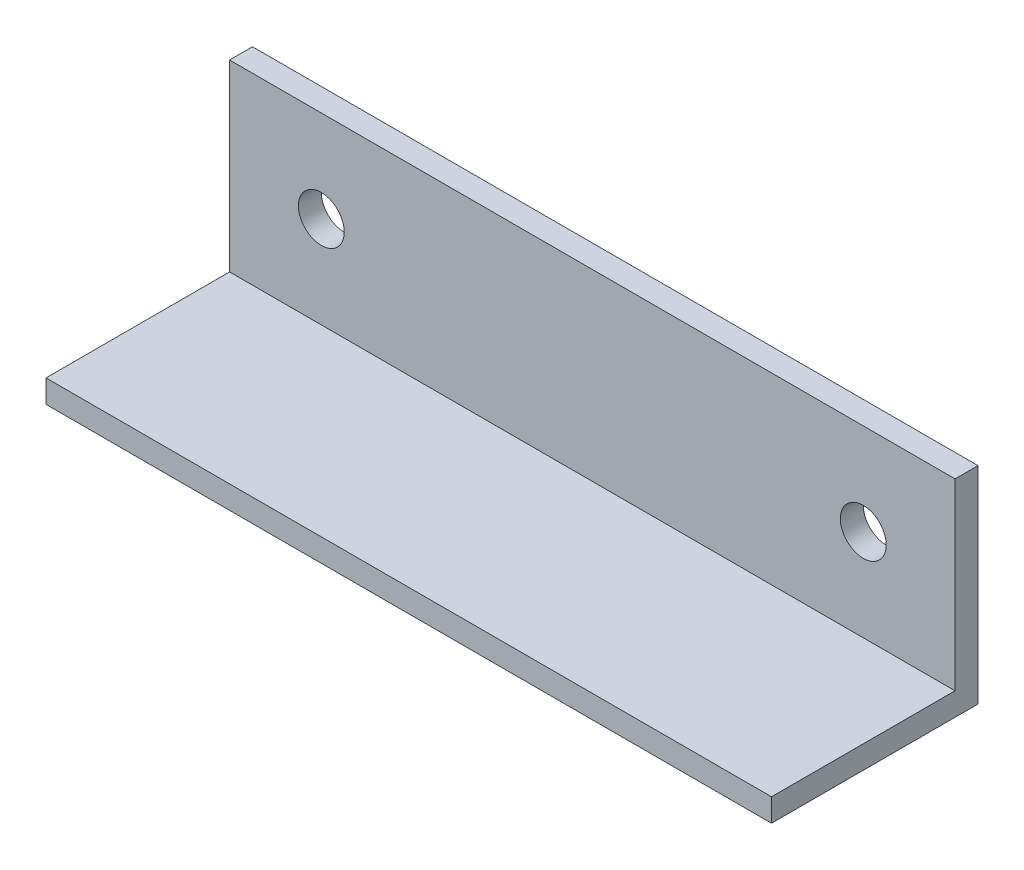
ISO-10303-21;
HEADER;
FILE_DESCRIPTION(('STEP AP214'),'2;1');
FILE_NAME('part.step','',(''),(''),'','','');
FILE_SCHEMA(('AUTOMOTIVE_DESIGN { 1 0 10303 214 1 1 1 1 }'));
ENDSEC;
DATA;
#1=APPLICATION_CONTEXT('core data for automotive mechanical design processes');
#2=APPLICATION_PROTOCOL_DEFINITION('international standard','automotive_design',2000,#1);
#3=PRODUCT_CONTEXT('',#1,'mechanical');
#4=PRODUCT('Part','Part','',(#3));
#5=PRODUCT_RELATED_PRODUCT_CATEGORY('part','',(#4));
#6=PRODUCT_DEFINITION_FORMATION('','',#4);
#7=PRODUCT_DEFINITION_CONTEXT('part definition',#1,'design');
#8=PRODUCT_DEFINITION('design','',#6,#7);
#9=PRODUCT_DEFINITION_SHAPE('','',#8);
#10=(LENGTH_UNIT() NAMED_UNIT(*) SI_UNIT(.MILLI.,.METRE.));
#11=(NAMED_UNIT(*) PLANE_ANGLE_UNIT() SI_UNIT($,.RADIAN.));
#12=(NAMED_UNIT(*) SI_UNIT($,.STERADIAN.) SOLID_ANGLE_UNIT());
#13=UNCERTAINTY_MEASURE_WITH_UNIT(LENGTH_MEASURE(1.E-05),#10,'distance_accuracy_value','');
#14=(GEOMETRIC_REPRESENTATION_CONTEXT(3) GLOBAL_UNCERTAINTY_ASSIGNED_CONTEXT((#13)) GLOBAL_UNIT_ASSIGNED_CONTEXT((#10,
#11,#12)) REPRESENTATION_CONTEXT('',''));
#15=CARTESIAN_POINT('',(0.,0.,0.));
#16=DIRECTION('',(0.,0.,1.));
#17=DIRECTION('',(1.,0.,0.));
#18=AXIS2_PLACEMENT_3D('',#15,#16,#17);
#19=CARTESIAN_POINT('',(0.,0.,3.175));
#20=DIRECTION('',(0.,0.,1.));
#21=DIRECTION('',(1.,0.,0.));
#22=AXIS2_PLACEMENT_3D('',#19,#20,#21);
#23=PLANE('',#22);
#24=DIRECTION('',(-1.,0.,0.));
#25=VECTOR('',#24,1.);
#26=CARTESIAN_POINT('',(-12.7,-12.7,3.175));
#27=LINE('',#26,#25);
#28=CARTESIAN_POINT('',(87.7,-12.7,3.175));
#29=VERTEX_POINT('',#28);
#30=CARTESIAN_POINT('',(-12.7,-12.7,3.175));
#31=VERTEX_POINT('',#30);
#32=EDGE_CURVE('E48',#29,#31,#27,.T.);
#33=ORIENTED_EDGE('',*,*,#32,.F.);
#34=DIRECTION('',(0.,1.,0.));
#35=VECTOR('',#34,1.);
#36=CARTESIAN_POINT('',(87.7,12.7,3.175));
#37=LINE('',#36,#35);
#38=CARTESIAN_POINT('',(87.7,12.7,3.175));
#39=VERTEX_POINT('',#38);
#40=EDGE_CURVE('E148',#29,#39,#37,.T.);
#41=ORIENTED_EDGE('',*,*,#40,.T.);
#42=DIRECTION('',(-1.,0.,0.));
#43=VECTOR('',#42,1.);
#44=CARTESIAN_POINT('',(-12.7,12.7,3.175));
#45=LINE('',#44,#43);
#46=CARTESIAN_POINT('',(-12.7,12.7,3.175));
#47=VERTEX_POINT('',#46);
#48=EDGE_CURVE('E54',#39,#47,#45,.T.);
#49=ORIENTED_EDGE('',*,*,#48,.T.);
#50=DIRECTION('',(0.,-1.,0.));
#51=VECTOR('',#50,1.);
#52=CARTESIAN_POINT('',(-12.7,12.7,3.175));
#53=LINE('',#52,#51);
#54=EDGE_CURVE('E83',#47,#31,#53,.T.);
#55=ORIENTED_EDGE('',*,*,#54,.T.);
#56=EDGE_LOOP('',(#33,#41,#49,#55));
#57=FACE_BOUND('',#56,.T.);
#58=CARTESIAN_POINT('',(0.,0.,3.175));
#59=DIRECTION('',(0.,0.,1.));
#60=DIRECTION('',(1.,0.,0.));
#61=AXIS2_PLACEMENT_3D('',#58,#59,#60);
#62=CIRCLE('',#61,3.175);
#63=CARTESIAN_POINT('',(3.175,0.,3.175));
#64=VERTEX_POINT('',#63);
#65=EDGE_CURVE('E95',#64,#64,#62,.T.);
#66=ORIENTED_EDGE('',*,*,#65,.F.);
#67=EDGE_LOOP('',(#66));
#68=FACE_BOUND('',#67,.T.);
#69=CARTESIAN_POINT('',(75.,0.,3.175));
#70=DIRECTION('',(0.,0.,1.));
#71=DIRECTION('',(1.,0.,0.));
#72=AXIS2_PLACEMENT_3D('',#69,#70,#71);
#73=CIRCLE('',#72,3.17500000000001);
#74=CARTESIAN_POINT('',(78.175,0.,3.175));
#75=VERTEX_POINT('',#74);
#76=EDGE_CURVE('E141',#75,#75,#73,.T.);
#77=ORIENTED_EDGE('',*,*,#76,.F.);
#78=EDGE_LOOP('',(#77));
#79=FACE_BOUND('',#78,.T.);
#80=ADVANCED_FACE('F33',(#57,#68,#79),#23,.T.);
#81=CARTESIAN_POINT('',(0.,0.,0.));
#82=DIRECTION('',(0.,0.,1.));
#83=DIRECTION('',(1.,0.,0.));
#84=AXIS2_PLACEMENT_3D('',#81,#82,#83);
#85=PLANE('',#84);
#86=DIRECTION('',(0.,-1.,0.));
#87=VECTOR('',#86,1.);
#88=CARTESIAN_POINT('',(-12.7,12.7,0.));
#89=LINE('',#88,#87);
#90=CARTESIAN_POINT('',(-12.7,12.7,0.));
#91=VERTEX_POINT('',#90);
#92=CARTESIAN_POINT('',(-12.7,-15.875,0.));
#93=VERTEX_POINT('',#92);
#94=EDGE_CURVE('E89',#91,#93,#89,.T.);
#95=ORIENTED_EDGE('',*,*,#94,.F.);
#96=DIRECTION('',(-1.,0.,0.));
#97=VECTOR('',#96,1.);
#98=CARTESIAN_POINT('',(-12.7,12.7,0.));
#99=LINE('',#98,#97);
#100=CARTESIAN_POINT('',(87.7,12.7,0.));
#101=VERTEX_POINT('',#100);
#102=EDGE_CURVE('E73',#101,#91,#99,.T.);
#103=ORIENTED_EDGE('',*,*,#102,.F.);
#104=DIRECTION('',(0.,1.,0.));
#105=VECTOR('',#104,1.);
#106=CARTESIAN_POINT('',(87.7,12.7,0.));
#107=LINE('',#106,#105);
#108=CARTESIAN_POINT('',(87.7,-15.875,0.));
#109=VERTEX_POINT('',#108);
#110=EDGE_CURVE('E84',#109,#101,#107,.T.);
#111=ORIENTED_EDGE('',*,*,#110,.F.);
#112=DIRECTION('',(1.,0.,0.));
#113=VECTOR('',#112,1.);
#114=CARTESIAN_POINT('',(-12.7,-15.875,0.));
#115=LINE('',#114,#113);
#116=EDGE_CURVE('E94',#93,#109,#115,.T.);
#117=ORIENTED_EDGE('',*,*,#116,.F.);
#118=EDGE_LOOP('',(#95,#103,#111,#117));
#119=FACE_BOUND('',#118,.T.);
#120=CARTESIAN_POINT('',(0.,0.,0.));
#121=DIRECTION('',(0.,0.,1.));
#122=DIRECTION('',(1.,0.,0.));
#123=AXIS2_PLACEMENT_3D('',#120,#121,#122);
#124=CIRCLE('',#123,3.175);
#125=CARTESIAN_POINT('',(3.175,0.,0.));
#126=VERTEX_POINT('',#125);
#127=EDGE_CURVE('E99',#126,#126,#124,.T.);
#128=ORIENTED_EDGE('',*,*,#127,.T.);
#129=EDGE_LOOP('',(#128));
#130=FACE_BOUND('',#129,.T.);
#131=CARTESIAN_POINT('',(75.,0.,0.));
#132=DIRECTION('',(0.,0.,1.));
#133=DIRECTION('',(1.,0.,0.));
#134=AXIS2_PLACEMENT_3D('',#131,#132,#133);
#135=CIRCLE('',#134,3.17500000000001);
#136=CARTESIAN_POINT('',(78.175,0.,0.));
#137=VERTEX_POINT('',#136);
#138=EDGE_CURVE('E140',#137,#137,#135,.T.);
#139=ORIENTED_EDGE('',*,*,#138,.T.);
#140=EDGE_LOOP('',(#139));
#141=FACE_BOUND('',#140,.T.);
#142=ADVANCED_FACE('F92',(#119,#130,#141),#85,.F.);
#143=CARTESIAN_POINT('',(-12.7,12.7,3.175));
#144=DIRECTION('',(1.,0.,0.));
#145=DIRECTION('',(0.,1.,0.));
#146=AXIS2_PLACEMENT_3D('',#143,#144,#145);
#147=PLANE('',#146);
#148=ORIENTED_EDGE('',*,*,#94,.T.);
#149=DIRECTION('',(0.,0.,-1.));
#150=VECTOR('',#149,1.);
#151=CARTESIAN_POINT('',(-12.7,-15.875,3.175));
#152=LINE('',#151,#150);
#153=CARTESIAN_POINT('',(-12.7,-15.875,28.575));
#154=VERTEX_POINT('',#153);
#155=EDGE_CURVE('E11',#154,#93,#152,.T.);
#156=ORIENTED_EDGE('',*,*,#155,.F.);
#157=DIRECTION('',(0.,-1.,0.));
#158=VECTOR('',#157,1.);
#159=CARTESIAN_POINT('',(-12.7,-15.875,28.575));
#160=LINE('',#159,#158);
#161=CARTESIAN_POINT('',(-12.7,-12.7,28.575));
#162=VERTEX_POINT('',#161);
#163=EDGE_CURVE('E127',#162,#154,#160,.T.);
#164=ORIENTED_EDGE('',*,*,#163,.F.);
#165=DIRECTION('',(0.,0.,-1.));
#166=VECTOR('',#165,1.);
#167=CARTESIAN_POINT('',(-12.7,-12.7,28.575));
#168=LINE('',#167,#166);
#169=EDGE_CURVE('E134',#162,#31,#168,.T.);
#170=ORIENTED_EDGE('',*,*,#169,.T.);
#171=ORIENTED_EDGE('',*,*,#54,.F.);
#172=DIRECTION('',(0.,0.,-1.));
#173=VECTOR('',#172,1.);
#174=CARTESIAN_POINT('',(-12.7,12.7,3.175));
#175=LINE('',#174,#173);
#176=EDGE_CURVE('E76',#47,#91,#175,.T.);
#177=ORIENTED_EDGE('',*,*,#176,.T.);
#178=EDGE_LOOP('',(#148,#156,#164,#170,#171,#177));
#179=FACE_BOUND('',#178,.T.);
#180=ADVANCED_FACE('F35',(#179),#147,.F.);
#181=CARTESIAN_POINT('',(-12.7,-15.875,3.175));
#182=DIRECTION('',(0.,1.,0.));
#183=DIRECTION('',(0.,0.,1.));
#184=AXIS2_PLACEMENT_3D('',#181,#182,#183);
#185=PLANE('',#184);
#186=ORIENTED_EDGE('',*,*,#116,.T.);
#187=DIRECTION('',(0.,0.,-1.));
#188=VECTOR('',#187,1.);
#189=CARTESIAN_POINT('',(87.7,-15.875,3.175));
#190=LINE('',#189,#188);
#191=CARTESIAN_POINT('',(87.7,-15.875,28.575));
#192=VERTEX_POINT('',#191);
#193=EDGE_CURVE('E41',#192,#109,#190,.T.);
#194=ORIENTED_EDGE('',*,*,#193,.F.);
#195=DIRECTION('',(1.,0.,0.));
#196=VECTOR('',#195,1.);
#197=CARTESIAN_POINT('',(-12.7,-15.875,28.575));
#198=LINE('',#197,#196);
#199=EDGE_CURVE('E119',#154,#192,#198,.T.);
#200=ORIENTED_EDGE('',*,*,#199,.F.);
#201=ORIENTED_EDGE('',*,*,#155,.T.);
#202=EDGE_LOOP('',(#186,#194,#200,#201));
#203=FACE_BOUND('',#202,.T.);
#204=ADVANCED_FACE('F117',(#203),#185,.F.);
#205=CARTESIAN_POINT('',(87.7,12.7,3.175));
#206=DIRECTION('',(-1.,0.,0.));
#207=DIRECTION('',(0.,0.,1.));
#208=AXIS2_PLACEMENT_3D('',#205,#206,#207);
#209=PLANE('',#208);
#210=ORIENTED_EDGE('',*,*,#110,.T.);
#211=DIRECTION('',(0.,0.,-1.));
#212=VECTOR('',#211,1.);
#213=CARTESIAN_POINT('',(87.7,12.7,3.175));
#214=LINE('',#213,#212);
#215=EDGE_CURVE('E79',#39,#101,#214,.T.);
#216=ORIENTED_EDGE('',*,*,#215,.F.);
#217=ORIENTED_EDGE('',*,*,#40,.F.);
#218=DIRECTION('',(0.,0.,-1.));
#219=VECTOR('',#218,1.);
#220=CARTESIAN_POINT('',(87.7,-12.7,28.575));
#221=LINE('',#220,#219);
#222=CARTESIAN_POINT('',(87.7,-12.7,28.575));
#223=VERTEX_POINT('',#222);
#224=EDGE_CURVE('E137',#223,#29,#221,.T.);
#225=ORIENTED_EDGE('',*,*,#224,.F.);
#226=DIRECTION('',(0.,1.,0.));
#227=VECTOR('',#226,1.);
#228=CARTESIAN_POINT('',(87.7,-15.875,28.575));
#229=LINE('',#228,#227);
#230=EDGE_CURVE('E113',#192,#223,#229,.T.);
#231=ORIENTED_EDGE('',*,*,#230,.F.);
#232=ORIENTED_EDGE('',*,*,#193,.T.);
#233=EDGE_LOOP('',(#210,#216,#217,#225,#231,#232));
#234=FACE_BOUND('',#233,.T.);
#235=ADVANCED_FACE('F109',(#234),#209,.F.);
#236=CARTESIAN_POINT('',(-12.7,12.7,3.175));
#237=DIRECTION('',(0.,-1.,0.));
#238=DIRECTION('',(0.,0.,-1.));
#239=AXIS2_PLACEMENT_3D('',#236,#237,#238);
#240=PLANE('',#239);
#241=ORIENTED_EDGE('',*,*,#102,.T.);
#242=ORIENTED_EDGE('',*,*,#176,.F.);
#243=ORIENTED_EDGE('',*,*,#48,.F.);
#244=ORIENTED_EDGE('',*,*,#215,.T.);
#245=EDGE_LOOP('',(#241,#242,#243,#244));
#246=FACE_BOUND('',#245,.T.);
#247=ADVANCED_FACE('F75',(#246),#240,.F.);
#248=CARTESIAN_POINT('',(0.,0.,3.175));
#249=DIRECTION('',(0.,0.,-1.));
#250=DIRECTION('',(-1.,0.,0.));
#251=AXIS2_PLACEMENT_3D('',#248,#249,#250);
#252=CYLINDRICAL_SURFACE('',#251,3.175);
#253=ORIENTED_EDGE('',*,*,#65,.T.);
#254=EDGE_LOOP('',(#253));
#255=FACE_BOUND('',#254,.T.);
#256=ORIENTED_EDGE('',*,*,#127,.F.);
#257=EDGE_LOOP('',(#256));
#258=FACE_BOUND('',#257,.T.);
#259=ADVANCED_FACE('F166',(#255,#258),#252,.F.);
#260=CARTESIAN_POINT('',(75.,0.,3.175));
#261=DIRECTION('',(0.,0.,-1.));
#262=DIRECTION('',(-1.,0.,0.));
#263=AXIS2_PLACEMENT_3D('',#260,#261,#262);
#264=CYLINDRICAL_SURFACE('',#263,3.17500000000001);
#265=ORIENTED_EDGE('',*,*,#76,.T.);
#266=EDGE_LOOP('',(#265));
#267=FACE_BOUND('',#266,.T.);
#268=ORIENTED_EDGE('',*,*,#138,.F.);
#269=EDGE_LOOP('',(#268));
#270=FACE_BOUND('',#269,.T.);
#271=ADVANCED_FACE('F159',(#267,#270),#264,.F.);
#272=CARTESIAN_POINT('',(-12.7,-12.7,28.575));
#273=DIRECTION('',(0.,-1.,0.));
#274=DIRECTION('',(0.,0.,-1.));
#275=AXIS2_PLACEMENT_3D('',#272,#273,#274);
#276=PLANE('',#275);
#277=ORIENTED_EDGE('',*,*,#32,.T.);
#278=ORIENTED_EDGE('',*,*,#169,.F.);
#279=DIRECTION('',(-1.,0.,0.));
#280=VECTOR('',#279,1.);
#281=CARTESIAN_POINT('',(-12.7,-12.7,28.575));
#282=LINE('',#281,#280);
#283=EDGE_CURVE('E129',#223,#162,#282,.T.);
#284=ORIENTED_EDGE('',*,*,#283,.F.);
#285=ORIENTED_EDGE('',*,*,#224,.T.);
#286=EDGE_LOOP('',(#277,#278,#284,#285));
#287=FACE_BOUND('',#286,.T.);
#288=ADVANCED_FACE('F152',(#287),#276,.F.);
#289=CARTESIAN_POINT('',(0.,0.,28.575));
#290=DIRECTION('',(0.,0.,-1.));
#291=DIRECTION('',(-1.,0.,0.));
#292=AXIS2_PLACEMENT_3D('',#289,#290,#291);
#293=PLANE('',#292);
#294=ORIENTED_EDGE('',*,*,#163,.T.);
#295=ORIENTED_EDGE('',*,*,#199,.T.);
#296=ORIENTED_EDGE('',*,*,#230,.T.);
#297=ORIENTED_EDGE('',*,*,#283,.T.);
#298=EDGE_LOOP('',(#294,#295,#296,#297));
#299=FACE_BOUND('',#298,.T.);
#300=ADVANCED_FACE('F124',(#299),#293,.F.);
#301=CLOSED_SHELL('',(#80,#142,#180,#204,#235,#247,#259,#271,#288,#300));
#302=MANIFOLD_SOLID_BREP('B2',#301);
#303=ADVANCED_BREP_SHAPE_REPRESENTATION('',(#18,#302),#14);
#304=SHAPE_DEFINITION_REPRESENTATION(#9,#303);
ENDSEC;
END-ISO-10303-21;
